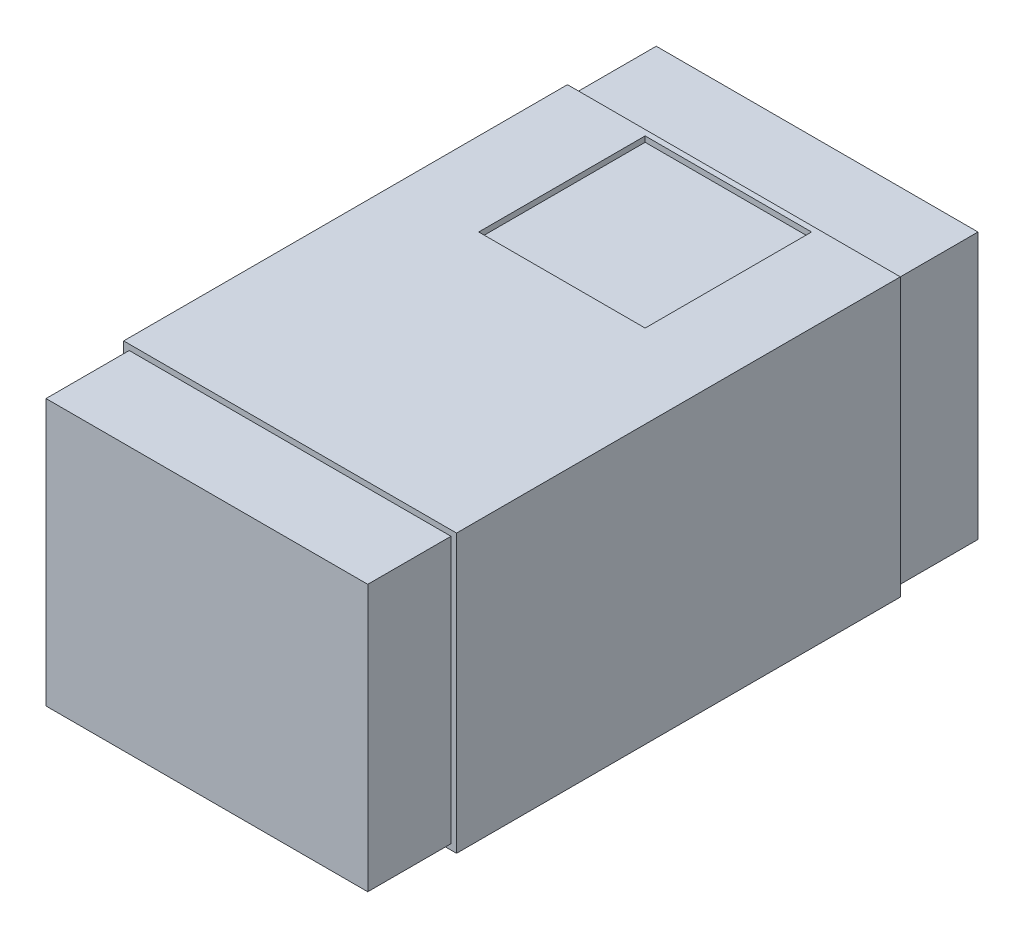
ISO-10303-21;
HEADER;
FILE_DESCRIPTION(('STEP AP214'),'2;1');
FILE_NAME('part.step','',(''),(''),'','','');
FILE_SCHEMA(('AUTOMOTIVE_DESIGN { 1 0 10303 214 1 1 1 1 }'));
ENDSEC;
DATA;
#1=APPLICATION_CONTEXT('core data for automotive mechanical design processes');
#2=APPLICATION_PROTOCOL_DEFINITION('international standard','automotive_design',2000,#1);
#3=PRODUCT_CONTEXT('',#1,'mechanical');
#4=PRODUCT('Part','Part','',(#3));
#5=PRODUCT_RELATED_PRODUCT_CATEGORY('part','',(#4));
#6=PRODUCT_DEFINITION_FORMATION('','',#4);
#7=PRODUCT_DEFINITION_CONTEXT('part definition',#1,'design');
#8=PRODUCT_DEFINITION('design','',#6,#7);
#9=PRODUCT_DEFINITION_SHAPE('','',#8);
#10=(LENGTH_UNIT() NAMED_UNIT(*) SI_UNIT(.MILLI.,.METRE.));
#11=(NAMED_UNIT(*) PLANE_ANGLE_UNIT() SI_UNIT($,.RADIAN.));
#12=(NAMED_UNIT(*) SI_UNIT($,.STERADIAN.) SOLID_ANGLE_UNIT());
#13=UNCERTAINTY_MEASURE_WITH_UNIT(LENGTH_MEASURE(1.E-05),#10,'distance_accuracy_value','');
#14=(GEOMETRIC_REPRESENTATION_CONTEXT(3) GLOBAL_UNCERTAINTY_ASSIGNED_CONTEXT((#13)) GLOBAL_UNIT_ASSIGNED_CONTEXT((#10,
#11,#12)) REPRESENTATION_CONTEXT('',''));
#15=CARTESIAN_POINT('',(0.,0.,0.));
#16=DIRECTION('',(0.,0.,1.));
#17=DIRECTION('',(1.,0.,0.));
#18=AXIS2_PLACEMENT_3D('',#15,#16,#17);
#19=CARTESIAN_POINT('',(0.3,0.,0.075));
#20=DIRECTION('',(0.,1.,0.));
#21=DIRECTION('',(1.,0.,0.));
#22=AXIS2_PLACEMENT_3D('',#19,#20,#21);
#23=PLANE('',#22);
#24=DIRECTION('',(-1.,0.,0.));
#25=VECTOR('',#24,1.);
#26=CARTESIAN_POINT('',(0.449999993294,0.,0.95));
#27=LINE('',#26,#25);
#28=CARTESIAN_POINT('',(0.599999993477,0.,0.95));
#29=VERTEX_POINT('',#28);
#30=CARTESIAN_POINT('',(0.,0.,0.95));
#31=VERTEX_POINT('',#30);
#32=EDGE_CURVE('E236',#29,#31,#27,.T.);
#33=ORIENTED_EDGE('',*,*,#32,.T.);
#34=DIRECTION('',(0.,0.,-1.));
#35=VECTOR('',#34,1.);
#36=CARTESIAN_POINT('',(0.,0.,0.15));
#37=LINE('',#36,#35);
#38=CARTESIAN_POINT('',(0.,0.,0.15));
#39=VERTEX_POINT('',#38);
#40=EDGE_CURVE('E277',#31,#39,#37,.T.);
#41=ORIENTED_EDGE('',*,*,#40,.T.);
#42=DIRECTION('',(1.,0.,0.));
#43=VECTOR('',#42,1.);
#44=CARTESIAN_POINT('',(0.15,0.,0.15));
#45=LINE('',#44,#43);
#46=CARTESIAN_POINT('',(0.599999993477,0.,0.15));
#47=VERTEX_POINT('',#46);
#48=EDGE_CURVE('E25',#39,#47,#45,.T.);
#49=ORIENTED_EDGE('',*,*,#48,.T.);
#50=DIRECTION('',(0.,0.,1.));
#51=VECTOR('',#50,1.);
#52=CARTESIAN_POINT('',(0.599999986589,0.,0.95));
#53=LINE('',#52,#51);
#54=EDGE_CURVE('E11',#47,#29,#53,.T.);
#55=ORIENTED_EDGE('',*,*,#54,.T.);
#56=EDGE_LOOP('',(#33,#41,#49,#55));
#57=FACE_BOUND('',#56,.T.);
#58=ADVANCED_FACE('F17',(#57),#23,.F.);
#59=CARTESIAN_POINT('',(0.6,0.,0.15));
#60=DIRECTION('',(1.,0.,0.));
#61=DIRECTION('',(0.,1.,0.));
#62=AXIS2_PLACEMENT_3D('',#59,#60,#61);
#63=PLANE('',#62);
#64=DIRECTION('',(0.,1.,0.));
#65=VECTOR('',#64,1.);
#66=CARTESIAN_POINT('',(0.6,0.,0.15));
#67=LINE('',#66,#65);
#68=CARTESIAN_POINT('',(0.599999993543,0.5,0.15));
#69=VERTEX_POINT('',#68);
#70=EDGE_CURVE('E339',#47,#69,#67,.T.);
#71=ORIENTED_EDGE('',*,*,#70,.T.);
#72=DIRECTION('',(0.,0.,-1.));
#73=VECTOR('',#72,1.);
#74=CARTESIAN_POINT('',(0.599999986589,0.5,0.95));
#75=LINE('',#74,#73);
#76=CARTESIAN_POINT('',(0.599999993543,0.5,0.95));
#77=VERTEX_POINT('',#76);
#78=EDGE_CURVE('E259',#77,#69,#75,.T.);
#79=ORIENTED_EDGE('',*,*,#78,.F.);
#80=DIRECTION('',(0.,-1.,0.));
#81=VECTOR('',#80,1.);
#82=CARTESIAN_POINT('',(0.6,0.,0.95));
#83=LINE('',#82,#81);
#84=EDGE_CURVE('E239',#77,#29,#83,.T.);
#85=ORIENTED_EDGE('',*,*,#84,.T.);
#86=ORIENTED_EDGE('',*,*,#54,.F.);
#87=EDGE_LOOP('',(#71,#79,#85,#86));
#88=FACE_BOUND('',#87,.T.);
#89=ADVANCED_FACE('F351',(#88),#63,.T.);
#90=CARTESIAN_POINT('',(0.,0.,1.099999975413));
#91=DIRECTION('',(0.,0.,1.));
#92=DIRECTION('',(1.,0.,0.));
#93=AXIS2_PLACEMENT_3D('',#90,#91,#92);
#94=PLANE('',#93);
#95=DIRECTION('',(0.,-1.,0.));
#96=VECTOR('',#95,1.);
#97=CARTESIAN_POINT('',(0.01,0.125,1.099999975413));
#98=LINE('',#97,#96);
#99=CARTESIAN_POINT('',(0.01,0.49,1.099999975413));
#100=VERTEX_POINT('',#99);
#101=CARTESIAN_POINT('',(0.01,0.01,1.099999975413));
#102=VERTEX_POINT('',#101);
#103=EDGE_CURVE('E166',#100,#102,#98,.T.);
#104=ORIENTED_EDGE('',*,*,#103,.T.);
#105=DIRECTION('',(1.,0.,0.));
#106=VECTOR('',#105,1.);
#107=CARTESIAN_POINT('',(0.149999996647,0.01,1.099999975413));
#108=LINE('',#107,#106);
#109=CARTESIAN_POINT('',(0.59,0.01,1.099999975413));
#110=VERTEX_POINT('',#109);
#111=EDGE_CURVE('E240',#102,#110,#108,.T.);
#112=ORIENTED_EDGE('',*,*,#111,.T.);
#113=DIRECTION('',(0.,1.,0.));
#114=VECTOR('',#113,1.);
#115=CARTESIAN_POINT('',(0.59,0.1275,1.099999975413));
#116=LINE('',#115,#114);
#117=CARTESIAN_POINT('',(0.59,0.49,1.099999975413));
#118=VERTEX_POINT('',#117);
#119=EDGE_CURVE('E169',#110,#118,#116,.T.);
#120=ORIENTED_EDGE('',*,*,#119,.T.);
#121=DIRECTION('',(-1.,0.,0.));
#122=VECTOR('',#121,1.);
#123=CARTESIAN_POINT('',(0.1475,0.49,1.099999975413));
#124=LINE('',#123,#122);
#125=EDGE_CURVE('E163',#118,#100,#124,.T.);
#126=ORIENTED_EDGE('',*,*,#125,.T.);
#127=EDGE_LOOP('',(#104,#112,#120,#126));
#128=FACE_BOUND('',#127,.T.);
#129=ADVANCED_FACE('F165',(#128),#94,.T.);
#130=CARTESIAN_POINT('',(0.,0.,0.15));
#131=DIRECTION('',(0.,0.,1.));
#132=DIRECTION('',(1.,0.,0.));
#133=AXIS2_PLACEMENT_3D('',#130,#131,#132);
#134=PLANE('',#133);
#135=DIRECTION('',(1.,0.,0.));
#136=VECTOR('',#135,1.);
#137=CARTESIAN_POINT('',(0.,0.01,0.15));
#138=LINE('',#137,#136);
#139=CARTESIAN_POINT('',(0.01,0.01,0.15));
#140=VERTEX_POINT('',#139);
#141=CARTESIAN_POINT('',(0.59,0.01,0.15));
#142=VERTEX_POINT('',#141);
#143=EDGE_CURVE('E212',#140,#142,#138,.T.);
#144=ORIENTED_EDGE('',*,*,#143,.T.);
#145=DIRECTION('',(0.,1.,0.));
#146=VECTOR('',#145,1.);
#147=CARTESIAN_POINT('',(0.59,0.5,0.15));
#148=LINE('',#147,#146);
#149=CARTESIAN_POINT('',(0.59,0.49,0.15));
#150=VERTEX_POINT('',#149);
#151=EDGE_CURVE('E247',#142,#150,#148,.T.);
#152=ORIENTED_EDGE('',*,*,#151,.T.);
#153=DIRECTION('',(-1.,0.,0.));
#154=VECTOR('',#153,1.);
#155=CARTESIAN_POINT('',(0.6,0.49,0.15));
#156=LINE('',#155,#154);
#157=CARTESIAN_POINT('',(0.01,0.49,0.15));
#158=VERTEX_POINT('',#157);
#159=EDGE_CURVE('E281',#150,#158,#156,.T.);
#160=ORIENTED_EDGE('',*,*,#159,.T.);
#161=DIRECTION('',(0.,-1.,0.));
#162=VECTOR('',#161,1.);
#163=CARTESIAN_POINT('',(0.01,0.500000023749,0.15));
#164=LINE('',#163,#162);
#165=EDGE_CURVE('E176',#158,#140,#164,.T.);
#166=ORIENTED_EDGE('',*,*,#165,.T.);
#167=EDGE_LOOP('',(#144,#152,#160,#166));
#168=FACE_BOUND('',#167,.T.);
#169=DIRECTION('',(0.,-1.,0.));
#170=VECTOR('',#169,1.);
#171=CARTESIAN_POINT('',(0.,0.,0.15));
#172=LINE('',#171,#170);
#173=CARTESIAN_POINT('',(0.,0.5,0.15));
#174=VERTEX_POINT('',#173);
#175=EDGE_CURVE('E273',#174,#39,#172,.T.);
#176=ORIENTED_EDGE('',*,*,#175,.F.);
#177=DIRECTION('',(-1.,0.,0.));
#178=VECTOR('',#177,1.);
#179=CARTESIAN_POINT('',(0.45,0.5,0.15));
#180=LINE('',#179,#178);
#181=EDGE_CURVE('E304',#69,#174,#180,.T.);
#182=ORIENTED_EDGE('',*,*,#181,.F.);
#183=ORIENTED_EDGE('',*,*,#70,.F.);
#184=ORIENTED_EDGE('',*,*,#48,.F.);
#185=EDGE_LOOP('',(#176,#182,#183,#184));
#186=FACE_BOUND('',#185,.T.);
#187=ADVANCED_FACE('F349',(#168,#186),#134,.F.);
#188=CARTESIAN_POINT('',(0.599999986589,0.,0.95));
#189=DIRECTION('',(0.,0.,-1.));
#190=DIRECTION('',(0.,-1.,0.));
#191=AXIS2_PLACEMENT_3D('',#188,#189,#190);
#192=PLANE('',#191);
#193=DIRECTION('',(0.,1.,0.));
#194=VECTOR('',#193,1.);
#195=CARTESIAN_POINT('',(0.01,0.,0.95));
#196=LINE('',#195,#194);
#197=CARTESIAN_POINT('',(0.01,0.01,0.95));
#198=VERTEX_POINT('',#197);
#199=CARTESIAN_POINT('',(0.01,0.49,0.95));
#200=VERTEX_POINT('',#199);
#201=EDGE_CURVE('E193',#198,#200,#196,.T.);
#202=ORIENTED_EDGE('',*,*,#201,.T.);
#203=DIRECTION('',(1.,0.,0.));
#204=VECTOR('',#203,1.);
#205=CARTESIAN_POINT('',(0.6,0.49,0.95));
#206=LINE('',#205,#204);
#207=CARTESIAN_POINT('',(0.59,0.49,0.95));
#208=VERTEX_POINT('',#207);
#209=EDGE_CURVE('E190',#200,#208,#206,.T.);
#210=ORIENTED_EDGE('',*,*,#209,.T.);
#211=DIRECTION('',(0.,-1.,0.));
#212=VECTOR('',#211,1.);
#213=CARTESIAN_POINT('',(0.59,0.5,0.95));
#214=LINE('',#213,#212);
#215=CARTESIAN_POINT('',(0.59,0.01,0.95));
#216=VERTEX_POINT('',#215);
#217=EDGE_CURVE('E260',#208,#216,#214,.T.);
#218=ORIENTED_EDGE('',*,*,#217,.T.);
#219=DIRECTION('',(-1.,0.,0.));
#220=VECTOR('',#219,1.);
#221=CARTESIAN_POINT('',(0.,0.01,0.95));
#222=LINE('',#221,#220);
#223=EDGE_CURVE('E325',#216,#198,#222,.T.);
#224=ORIENTED_EDGE('',*,*,#223,.T.);
#225=EDGE_LOOP('',(#202,#210,#218,#224));
#226=FACE_BOUND('',#225,.T.);
#227=DIRECTION('',(0.,1.,0.));
#228=VECTOR('',#227,1.);
#229=CARTESIAN_POINT('',(0.,0.,0.95));
#230=LINE('',#229,#228);
#231=CARTESIAN_POINT('',(0.,0.5,0.95));
#232=VERTEX_POINT('',#231);
#233=EDGE_CURVE('E254',#31,#232,#230,.T.);
#234=ORIENTED_EDGE('',*,*,#233,.F.);
#235=ORIENTED_EDGE('',*,*,#32,.F.);
#236=ORIENTED_EDGE('',*,*,#84,.F.);
#237=DIRECTION('',(1.,0.,0.));
#238=VECTOR('',#237,1.);
#239=CARTESIAN_POINT('',(0.45,0.5,0.95));
#240=LINE('',#239,#238);
#241=EDGE_CURVE('E255',#232,#77,#240,.T.);
#242=ORIENTED_EDGE('',*,*,#241,.F.);
#243=EDGE_LOOP('',(#234,#235,#236,#242));
#244=FACE_BOUND('',#243,.T.);
#245=ADVANCED_FACE('F358',(#226,#244),#192,.F.);
#246=CARTESIAN_POINT('',(0.299999993294,0.01,1.024999987707));
#247=DIRECTION('',(0.,1.,0.));
#248=DIRECTION('',(1.,0.,0.));
#249=AXIS2_PLACEMENT_3D('',#246,#247,#248);
#250=PLANE('',#249);
#251=DIRECTION('',(0.,0.,-1.));
#252=VECTOR('',#251,1.);
#253=CARTESIAN_POINT('',(0.01,0.01,1.024999987707));
#254=LINE('',#253,#252);
#255=EDGE_CURVE('E184',#102,#198,#254,.T.);
#256=ORIENTED_EDGE('',*,*,#255,.T.);
#257=ORIENTED_EDGE('',*,*,#223,.F.);
#258=DIRECTION('',(0.,0.,1.));
#259=VECTOR('',#258,1.);
#260=CARTESIAN_POINT('',(0.59,0.01,1.024999987707));
#261=LINE('',#260,#259);
#262=EDGE_CURVE('E294',#216,#110,#261,.T.);
#263=ORIENTED_EDGE('',*,*,#262,.T.);
#264=ORIENTED_EDGE('',*,*,#111,.F.);
#265=EDGE_LOOP('',(#256,#257,#263,#264));
#266=FACE_BOUND('',#265,.T.);
#267=ADVANCED_FACE('F395',(#266),#250,.F.);
#268=CARTESIAN_POINT('',(0.300000014249,0.49,0.310000014724));
#269=DIRECTION('',(0.,-1.,0.));
#270=DIRECTION('',(0.,0.,-1.));
#271=AXIS2_PLACEMENT_3D('',#268,#269,#270);
#272=PLANE('',#271);
#273=DIRECTION('',(-1.,0.,0.));
#274=VECTOR('',#273,1.);
#275=CARTESIAN_POINT('',(0.450000021374,0.49,0.460000021849));
#276=LINE('',#275,#274);
#277=CARTESIAN_POINT('',(0.450000021374,0.49,0.460000021849));
#278=VERTEX_POINT('',#277);
#279=CARTESIAN_POINT('',(0.150000007125,0.49,0.460000021849));
#280=VERTEX_POINT('',#279);
#281=EDGE_CURVE('E332',#278,#280,#276,.T.);
#282=ORIENTED_EDGE('',*,*,#281,.F.);
#283=DIRECTION('',(0.,0.,1.));
#284=VECTOR('',#283,1.);
#285=CARTESIAN_POINT('',(0.450000021374,0.49,0.1600000076));
#286=LINE('',#285,#284);
#287=CARTESIAN_POINT('',(0.450000021374,0.49,0.1600000076));
#288=VERTEX_POINT('',#287);
#289=EDGE_CURVE('E316',#288,#278,#286,.T.);
#290=ORIENTED_EDGE('',*,*,#289,.F.);
#291=DIRECTION('',(1.,0.,0.));
#292=VECTOR('',#291,1.);
#293=CARTESIAN_POINT('',(0.150000007125,0.49,0.1600000076));
#294=LINE('',#293,#292);
#295=CARTESIAN_POINT('',(0.150000007125,0.49,0.1600000076));
#296=VERTEX_POINT('',#295);
#297=EDGE_CURVE('E265',#296,#288,#294,.T.);
#298=ORIENTED_EDGE('',*,*,#297,.F.);
#299=DIRECTION('',(0.,0.,-1.));
#300=VECTOR('',#299,1.);
#301=CARTESIAN_POINT('',(0.150000007125,0.49,0.460000021849));
#302=LINE('',#301,#300);
#303=EDGE_CURVE('E329',#280,#296,#302,.T.);
#304=ORIENTED_EDGE('',*,*,#303,.F.);
#305=EDGE_LOOP('',(#282,#290,#298,#304));
#306=FACE_BOUND('',#305,.T.);
#307=ADVANCED_FACE('F401',(#306),#272,.F.);
#308=CARTESIAN_POINT('',(0.450000021374,0.5,0.460000021849));
#309=DIRECTION('',(0.,0.,1.));
#310=DIRECTION('',(1.,0.,0.));
#311=AXIS2_PLACEMENT_3D('',#308,#309,#310);
#312=PLANE('',#311);
#313=DIRECTION('',(-1.,0.,0.));
#314=VECTOR('',#313,1.);
#315=CARTESIAN_POINT('',(0.375000010687,0.5,0.460000021849));
#316=LINE('',#315,#314);
#317=CARTESIAN_POINT('',(0.450000021374,0.5,0.460000021849));
#318=VERTEX_POINT('',#317);
#319=CARTESIAN_POINT('',(0.150000007125,0.5,0.460000021849));
#320=VERTEX_POINT('',#319);
#321=EDGE_CURVE('E207',#318,#320,#316,.T.);
#322=ORIENTED_EDGE('',*,*,#321,.F.);
#323=DIRECTION('',(0.,-1.,0.));
#324=VECTOR('',#323,1.);
#325=CARTESIAN_POINT('',(0.450000021374,0.5,0.460000021849));
#326=LINE('',#325,#324);
#327=EDGE_CURVE('E285',#318,#278,#326,.T.);
#328=ORIENTED_EDGE('',*,*,#327,.T.);
#329=ORIENTED_EDGE('',*,*,#281,.T.);
#330=DIRECTION('',(0.,-1.,0.));
#331=VECTOR('',#330,1.);
#332=CARTESIAN_POINT('',(0.150000007125,0.5,0.460000021849));
#333=LINE('',#332,#331);
#334=EDGE_CURVE('E268',#320,#280,#333,.T.);
#335=ORIENTED_EDGE('',*,*,#334,.F.);
#336=EDGE_LOOP('',(#322,#328,#329,#335));
#337=FACE_BOUND('',#336,.T.);
#338=ADVANCED_FACE('F397',(#337),#312,.F.);
#339=CARTESIAN_POINT('',(0.150000007125,0.5,0.460000021849));
#340=DIRECTION('',(-1.,0.,0.));
#341=DIRECTION('',(0.,0.,1.));
#342=AXIS2_PLACEMENT_3D('',#339,#340,#341);
#343=PLANE('',#342);
#344=DIRECTION('',(0.,0.,-1.));
#345=VECTOR('',#344,1.);
#346=CARTESIAN_POINT('',(0.150000007125,0.5,0.267500010924));
#347=LINE('',#346,#345);
#348=CARTESIAN_POINT('',(0.150000007125,0.5,0.1600000076));
#349=VERTEX_POINT('',#348);
#350=EDGE_CURVE('E211',#320,#349,#347,.T.);
#351=ORIENTED_EDGE('',*,*,#350,.F.);
#352=ORIENTED_EDGE('',*,*,#334,.T.);
#353=ORIENTED_EDGE('',*,*,#303,.T.);
#354=DIRECTION('',(0.,-1.,0.));
#355=VECTOR('',#354,1.);
#356=CARTESIAN_POINT('',(0.150000007125,0.5,0.1600000076));
#357=LINE('',#356,#355);
#358=EDGE_CURVE('E269',#349,#296,#357,.T.);
#359=ORIENTED_EDGE('',*,*,#358,.F.);
#360=EDGE_LOOP('',(#351,#352,#353,#359));
#361=FACE_BOUND('',#360,.T.);
#362=ADVANCED_FACE('F400',(#361),#343,.F.);
#363=CARTESIAN_POINT('',(0.150000007125,0.5,0.1600000076));
#364=DIRECTION('',(0.,0.,-1.));
#365=DIRECTION('',(0.,-1.,0.));
#366=AXIS2_PLACEMENT_3D('',#363,#364,#365);
#367=PLANE('',#366);
#368=DIRECTION('',(1.,0.,0.));
#369=VECTOR('',#368,1.);
#370=CARTESIAN_POINT('',(0.225000003562,0.5,0.1600000076));
#371=LINE('',#370,#369);
#372=CARTESIAN_POINT('',(0.450000021374,0.5,0.1600000076));
#373=VERTEX_POINT('',#372);
#374=EDGE_CURVE('E243',#349,#373,#371,.T.);
#375=ORIENTED_EDGE('',*,*,#374,.F.);
#376=ORIENTED_EDGE('',*,*,#358,.T.);
#377=ORIENTED_EDGE('',*,*,#297,.T.);
#378=DIRECTION('',(0.,-1.,0.));
#379=VECTOR('',#378,1.);
#380=CARTESIAN_POINT('',(0.450000021374,0.5,0.1600000076));
#381=LINE('',#380,#379);
#382=EDGE_CURVE('E312',#373,#288,#381,.T.);
#383=ORIENTED_EDGE('',*,*,#382,.F.);
#384=EDGE_LOOP('',(#375,#376,#377,#383));
#385=FACE_BOUND('',#384,.T.);
#386=ADVANCED_FACE('F405',(#385),#367,.F.);
#387=CARTESIAN_POINT('',(0.450000021374,0.5,0.1600000076));
#388=DIRECTION('',(1.,0.,0.));
#389=DIRECTION('',(0.,1.,0.));
#390=AXIS2_PLACEMENT_3D('',#387,#388,#389);
#391=PLANE('',#390);
#392=DIRECTION('',(0.,0.,1.));
#393=VECTOR('',#392,1.);
#394=CARTESIAN_POINT('',(0.450000021374,0.5,0.1175000038));
#395=LINE('',#394,#393);
#396=EDGE_CURVE('E202',#373,#318,#395,.T.);
#397=ORIENTED_EDGE('',*,*,#396,.F.);
#398=ORIENTED_EDGE('',*,*,#382,.T.);
#399=ORIENTED_EDGE('',*,*,#289,.T.);
#400=ORIENTED_EDGE('',*,*,#327,.F.);
#401=EDGE_LOOP('',(#397,#398,#399,#400));
#402=FACE_BOUND('',#401,.T.);
#403=ADVANCED_FACE('F411',(#402),#391,.F.);
#404=CARTESIAN_POINT('',(0.59,0.255,0.075));
#405=DIRECTION('',(-1.,0.,0.));
#406=DIRECTION('',(0.,0.,1.));
#407=AXIS2_PLACEMENT_3D('',#404,#405,#406);
#408=PLANE('',#407);
#409=DIRECTION('',(0.,0.,1.));
#410=VECTOR('',#409,1.);
#411=CARTESIAN_POINT('',(0.59,0.49,0.075));
#412=LINE('',#411,#410);
#413=CARTESIAN_POINT('',(0.59,0.49,0.));
#414=VERTEX_POINT('',#413);
#415=EDGE_CURVE('E288',#414,#150,#412,.T.);
#416=ORIENTED_EDGE('',*,*,#415,.T.);
#417=ORIENTED_EDGE('',*,*,#151,.F.);
#418=DIRECTION('',(0.,0.,1.));
#419=VECTOR('',#418,1.);
#420=CARTESIAN_POINT('',(0.59,0.01,0.075));
#421=LINE('',#420,#419);
#422=CARTESIAN_POINT('',(0.59,0.01,0.));
#423=VERTEX_POINT('',#422);
#424=EDGE_CURVE('E216',#423,#142,#421,.T.);
#425=ORIENTED_EDGE('',*,*,#424,.F.);
#426=DIRECTION('',(0.,-1.,0.));
#427=VECTOR('',#426,1.);
#428=CARTESIAN_POINT('',(0.59,0.1275,0.));
#429=LINE('',#428,#427);
#430=EDGE_CURVE('E251',#414,#423,#429,.T.);
#431=ORIENTED_EDGE('',*,*,#430,.F.);
#432=EDGE_LOOP('',(#416,#417,#425,#431));
#433=FACE_BOUND('',#432,.T.);
#434=ADVANCED_FACE('F413',(#433),#408,.F.);
#435=CARTESIAN_POINT('',(0.3,0.5,0.075));
#436=DIRECTION('',(0.,1.,0.));
#437=DIRECTION('',(1.,0.,0.));
#438=AXIS2_PLACEMENT_3D('',#435,#436,#437);
#439=PLANE('',#438);
#440=ORIENTED_EDGE('',*,*,#396,.T.);
#441=ORIENTED_EDGE('',*,*,#321,.T.);
#442=ORIENTED_EDGE('',*,*,#350,.T.);
#443=ORIENTED_EDGE('',*,*,#374,.T.);
#444=EDGE_LOOP('',(#440,#441,#442,#443));
#445=FACE_BOUND('',#444,.T.);
#446=ORIENTED_EDGE('',*,*,#241,.T.);
#447=ORIENTED_EDGE('',*,*,#78,.T.);
#448=ORIENTED_EDGE('',*,*,#181,.T.);
#449=DIRECTION('',(0.,0.,1.));
#450=VECTOR('',#449,1.);
#451=CARTESIAN_POINT('',(0.,0.5,0.15));
#452=LINE('',#451,#450);
#453=EDGE_CURVE('E264',#174,#232,#452,.T.);
#454=ORIENTED_EDGE('',*,*,#453,.T.);
#455=EDGE_LOOP('',(#446,#447,#448,#454));
#456=FACE_BOUND('',#455,.T.);
#457=ADVANCED_FACE('F354',(#445,#456),#439,.T.);
#458=CARTESIAN_POINT('',(0.59,0.255,1.024999987707));
#459=DIRECTION('',(-1.,0.,0.));
#460=DIRECTION('',(0.,0.,1.));
#461=AXIS2_PLACEMENT_3D('',#458,#459,#460);
#462=PLANE('',#461);
#463=DIRECTION('',(0.,0.,1.));
#464=VECTOR('',#463,1.);
#465=CARTESIAN_POINT('',(0.59,0.49,1.024999987707));
#466=LINE('',#465,#464);
#467=EDGE_CURVE('E175',#208,#118,#466,.T.);
#468=ORIENTED_EDGE('',*,*,#467,.T.);
#469=ORIENTED_EDGE('',*,*,#119,.F.);
#470=ORIENTED_EDGE('',*,*,#262,.F.);
#471=ORIENTED_EDGE('',*,*,#217,.F.);
#472=EDGE_LOOP('',(#468,#469,#470,#471));
#473=FACE_BOUND('',#472,.T.);
#474=ADVANCED_FACE('F374',(#473),#462,.F.);
#475=CARTESIAN_POINT('',(0.295,0.49,0.075));
#476=DIRECTION('',(0.,-1.,0.));
#477=DIRECTION('',(0.,0.,-1.));
#478=AXIS2_PLACEMENT_3D('',#475,#476,#477);
#479=PLANE('',#478);
#480=DIRECTION('',(0.,0.,1.));
#481=VECTOR('',#480,1.);
#482=CARTESIAN_POINT('',(0.01,0.49,0.075));
#483=LINE('',#482,#481);
#484=CARTESIAN_POINT('',(0.01,0.49,0.));
#485=VERTEX_POINT('',#484);
#486=EDGE_CURVE('E186',#485,#158,#483,.T.);
#487=ORIENTED_EDGE('',*,*,#486,.T.);
#488=ORIENTED_EDGE('',*,*,#159,.F.);
#489=ORIENTED_EDGE('',*,*,#415,.F.);
#490=DIRECTION('',(1.,0.,0.));
#491=VECTOR('',#490,1.);
#492=CARTESIAN_POINT('',(0.4475,0.49,0.));
#493=LINE('',#492,#491);
#494=EDGE_CURVE('E215',#485,#414,#493,.T.);
#495=ORIENTED_EDGE('',*,*,#494,.F.);
#496=EDGE_LOOP('',(#487,#488,#489,#495));
#497=FACE_BOUND('',#496,.T.);
#498=ADVANCED_FACE('F363',(#497),#479,.F.);
#499=CARTESIAN_POINT('',(0.,0.,0.));
#500=DIRECTION('',(-1.,0.,0.));
#501=DIRECTION('',(0.,0.,1.));
#502=AXIS2_PLACEMENT_3D('',#499,#500,#501);
#503=PLANE('',#502);
#504=ORIENTED_EDGE('',*,*,#233,.T.);
#505=ORIENTED_EDGE('',*,*,#453,.F.);
#506=ORIENTED_EDGE('',*,*,#175,.T.);
#507=ORIENTED_EDGE('',*,*,#40,.F.);
#508=EDGE_LOOP('',(#504,#505,#506,#507));
#509=FACE_BOUND('',#508,.T.);
#510=ADVANCED_FACE('F360',(#509),#503,.T.);
#511=CARTESIAN_POINT('',(0.6,0.,0.));
#512=DIRECTION('',(0.,0.,-1.));
#513=DIRECTION('',(0.,-1.,0.));
#514=AXIS2_PLACEMENT_3D('',#511,#512,#513);
#515=PLANE('',#514);
#516=DIRECTION('',(0.,1.,0.));
#517=VECTOR('',#516,1.);
#518=CARTESIAN_POINT('',(0.01,0.125,0.));
#519=LINE('',#518,#517);
#520=CARTESIAN_POINT('',(0.01,0.01,0.));
#521=VERTEX_POINT('',#520);
#522=EDGE_CURVE('E221',#521,#485,#519,.T.);
#523=ORIENTED_EDGE('',*,*,#522,.T.);
#524=ORIENTED_EDGE('',*,*,#494,.T.);
#525=ORIENTED_EDGE('',*,*,#430,.T.);
#526=DIRECTION('',(-1.,0.,0.));
#527=VECTOR('',#526,1.);
#528=CARTESIAN_POINT('',(0.45,0.01,0.));
#529=LINE('',#528,#527);
#530=EDGE_CURVE('E225',#423,#521,#529,.T.);
#531=ORIENTED_EDGE('',*,*,#530,.T.);
#532=EDGE_LOOP('',(#523,#524,#525,#531));
#533=FACE_BOUND('',#532,.T.);
#534=ADVANCED_FACE('F362',(#533),#515,.T.);
#535=CARTESIAN_POINT('',(0.3,0.01,0.075));
#536=DIRECTION('',(0.,1.,0.));
#537=DIRECTION('',(1.,0.,0.));
#538=AXIS2_PLACEMENT_3D('',#535,#536,#537);
#539=PLANE('',#538);
#540=DIRECTION('',(0.,0.,-1.));
#541=VECTOR('',#540,1.);
#542=CARTESIAN_POINT('',(0.01,0.01,0.075));
#543=LINE('',#542,#541);
#544=EDGE_CURVE('E229',#140,#521,#543,.T.);
#545=ORIENTED_EDGE('',*,*,#544,.T.);
#546=ORIENTED_EDGE('',*,*,#530,.F.);
#547=ORIENTED_EDGE('',*,*,#424,.T.);
#548=ORIENTED_EDGE('',*,*,#143,.F.);
#549=EDGE_LOOP('',(#545,#546,#547,#548));
#550=FACE_BOUND('',#549,.T.);
#551=ADVANCED_FACE('F370',(#550),#539,.F.);
#552=CARTESIAN_POINT('',(0.295,0.49,1.024999987707));
#553=DIRECTION('',(0.,-1.,0.));
#554=DIRECTION('',(0.,0.,-1.));
#555=AXIS2_PLACEMENT_3D('',#552,#553,#554);
#556=PLANE('',#555);
#557=DIRECTION('',(0.,0.,1.));
#558=VECTOR('',#557,1.);
#559=CARTESIAN_POINT('',(0.01,0.49,1.024999987707));
#560=LINE('',#559,#558);
#561=EDGE_CURVE('E182',#200,#100,#560,.T.);
#562=ORIENTED_EDGE('',*,*,#561,.T.);
#563=ORIENTED_EDGE('',*,*,#125,.F.);
#564=ORIENTED_EDGE('',*,*,#467,.F.);
#565=ORIENTED_EDGE('',*,*,#209,.F.);
#566=EDGE_LOOP('',(#562,#563,#564,#565));
#567=FACE_BOUND('',#566,.T.);
#568=ADVANCED_FACE('F188',(#567),#556,.F.);
#569=CARTESIAN_POINT('',(0.01,0.25,0.075));
#570=DIRECTION('',(1.,0.,0.));
#571=DIRECTION('',(0.,1.,0.));
#572=AXIS2_PLACEMENT_3D('',#569,#570,#571);
#573=PLANE('',#572);
#574=ORIENTED_EDGE('',*,*,#486,.F.);
#575=ORIENTED_EDGE('',*,*,#522,.F.);
#576=ORIENTED_EDGE('',*,*,#544,.F.);
#577=ORIENTED_EDGE('',*,*,#165,.F.);
#578=EDGE_LOOP('',(#574,#575,#576,#577));
#579=FACE_BOUND('',#578,.T.);
#580=ADVANCED_FACE('F583',(#579),#573,.F.);
#581=CARTESIAN_POINT('',(0.01,0.25,1.024999987707));
#582=DIRECTION('',(1.,0.,0.));
#583=DIRECTION('',(0.,1.,0.));
#584=AXIS2_PLACEMENT_3D('',#581,#582,#583);
#585=PLANE('',#584);
#586=ORIENTED_EDGE('',*,*,#561,.F.);
#587=ORIENTED_EDGE('',*,*,#201,.F.);
#588=ORIENTED_EDGE('',*,*,#255,.F.);
#589=ORIENTED_EDGE('',*,*,#103,.F.);
#590=EDGE_LOOP('',(#586,#587,#588,#589));
#591=FACE_BOUND('',#590,.T.);
#592=ADVANCED_FACE('F180',(#591),#585,.F.);
#593=CLOSED_SHELL('',(#58,#89,#129,#187,#245,#267,#307,#338,#362,#386,#403,#434,#457,#474,#498,
#510,#534,#551,#568,#580,#592));
#594=MANIFOLD_SOLID_BREP('B1',#593);
#595=ADVANCED_BREP_SHAPE_REPRESENTATION('',(#18,#594),#14);
#596=SHAPE_DEFINITION_REPRESENTATION(#9,#595);
ENDSEC;
END-ISO-10303-21;
